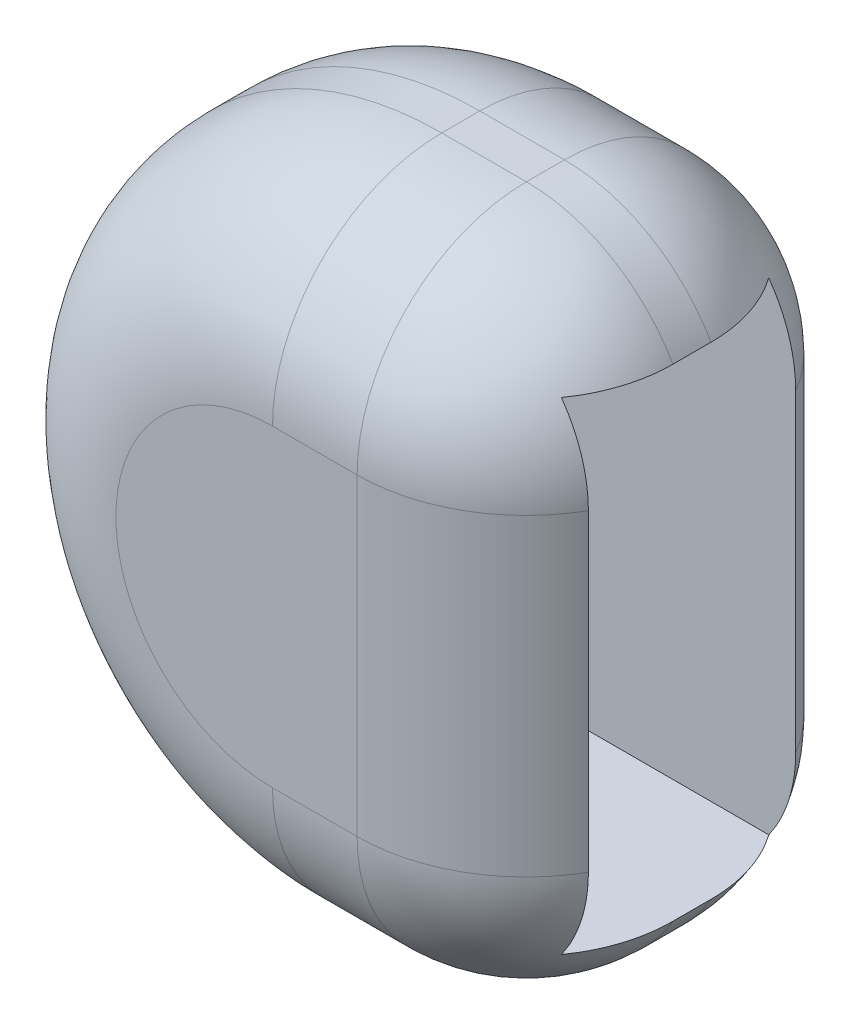
ISO-10303-21;
HEADER;
FILE_DESCRIPTION(('STEP AP214'),'2;1');
FILE_NAME('part.step','',(''),(''),'','','');
FILE_SCHEMA(('AUTOMOTIVE_DESIGN { 1 0 10303 214 1 1 1 1 }'));
ENDSEC;
DATA;
#1=APPLICATION_CONTEXT('core data for automotive mechanical design processes');
#2=APPLICATION_PROTOCOL_DEFINITION('international standard','automotive_design',2000,#1);
#3=PRODUCT_CONTEXT('',#1,'mechanical');
#4=PRODUCT('Part','Part','',(#3));
#5=PRODUCT_RELATED_PRODUCT_CATEGORY('part','',(#4));
#6=PRODUCT_DEFINITION_FORMATION('','',#4);
#7=PRODUCT_DEFINITION_CONTEXT('part definition',#1,'design');
#8=PRODUCT_DEFINITION('design','',#6,#7);
#9=PRODUCT_DEFINITION_SHAPE('','',#8);
#10=(LENGTH_UNIT() NAMED_UNIT(*) SI_UNIT(.MILLI.,.METRE.));
#11=(NAMED_UNIT(*) PLANE_ANGLE_UNIT() SI_UNIT($,.RADIAN.));
#12=(NAMED_UNIT(*) SI_UNIT($,.STERADIAN.) SOLID_ANGLE_UNIT());
#13=UNCERTAINTY_MEASURE_WITH_UNIT(LENGTH_MEASURE(1.E-05),#10,'distance_accuracy_value','');
#14=(GEOMETRIC_REPRESENTATION_CONTEXT(3) GLOBAL_UNCERTAINTY_ASSIGNED_CONTEXT((#13)) GLOBAL_UNIT_ASSIGNED_CONTEXT((#10,
#11,#12)) REPRESENTATION_CONTEXT('',''));
#15=CARTESIAN_POINT('',(0.,0.,0.));
#16=DIRECTION('',(0.,0.,1.));
#17=DIRECTION('',(1.,0.,0.));
#18=AXIS2_PLACEMENT_3D('',#15,#16,#17);
#19=CARTESIAN_POINT('',(0.,0.,12.25));
#20=DIRECTION('',(0.,0.,-1.));
#21=DIRECTION('',(-1.,0.,0.));
#22=AXIS2_PLACEMENT_3D('',#19,#20,#21);
#23=CYLINDRICAL_SURFACE('',#22,14.25);
#24=CARTESIAN_POINT('',(0.,0.,0.));
#25=DIRECTION('',(0.,0.,-1.));
#26=DIRECTION('',(-1.,0.,0.));
#27=AXIS2_PLACEMENT_3D('',#24,#25,#26);
#28=CIRCLE('',#27,14.25);
#29=CARTESIAN_POINT('',(0.,-14.25,0.));
#30=VERTEX_POINT('',#29);
#31=CARTESIAN_POINT('',(0.,14.25,0.));
#32=VERTEX_POINT('',#31);
#33=EDGE_CURVE('E168',#30,#32,#28,.T.);
#34=ORIENTED_EDGE('',*,*,#33,.T.);
#35=DIRECTION('',(0.,0.,-1.));
#36=VECTOR('',#35,1.);
#37=CARTESIAN_POINT('',(0.,14.25,12.25));
#38=LINE('',#37,#36);
#39=CARTESIAN_POINT('',(0.,14.25,12.25));
#40=VERTEX_POINT('',#39);
#41=EDGE_CURVE('E178',#40,#32,#38,.T.);
#42=ORIENTED_EDGE('',*,*,#41,.F.);
#43=CARTESIAN_POINT('',(0.,0.,12.25));
#44=DIRECTION('',(0.,0.,-1.));
#45=DIRECTION('',(-1.,0.,0.));
#46=AXIS2_PLACEMENT_3D('',#43,#44,#45);
#47=CIRCLE('',#46,14.25);
#48=CARTESIAN_POINT('',(0.,-14.25,12.25));
#49=VERTEX_POINT('',#48);
#50=EDGE_CURVE('E204',#49,#40,#47,.T.);
#51=ORIENTED_EDGE('',*,*,#50,.F.);
#52=DIRECTION('',(0.,0.,-1.));
#53=VECTOR('',#52,1.);
#54=CARTESIAN_POINT('',(0.,-14.25,12.25));
#55=LINE('',#54,#53);
#56=EDGE_CURVE('E190',#49,#30,#55,.T.);
#57=ORIENTED_EDGE('',*,*,#56,.T.);
#58=EDGE_LOOP('',(#34,#42,#51,#57));
#59=FACE_BOUND('',#58,.T.);
#60=ADVANCED_FACE('F47',(#59),#23,.F.);
#61=CARTESIAN_POINT('',(15.,14.25,12.25));
#62=DIRECTION('',(0.,1.,0.));
#63=DIRECTION('',(-1.,0.,0.));
#64=AXIS2_PLACEMENT_3D('',#61,#62,#63);
#65=PLANE('',#64);
#66=DIRECTION('',(0.,0.,-1.));
#67=VECTOR('',#66,1.);
#68=CARTESIAN_POINT('',(13.6602540378444,14.25,5.));
#69=LINE('',#68,#67);
#70=CARTESIAN_POINT('',(13.6602540378444,14.25,5.));
#71=VERTEX_POINT('',#70);
#72=CARTESIAN_POINT('',(13.6602540378444,14.25,7.25));
#73=VERTEX_POINT('',#72);
#74=EDGE_CURVE('E291',#71,#73,#69,.F.);
#75=ORIENTED_EDGE('',*,*,#74,.T.);
#76=CARTESIAN_POINT('',(5.,14.25,7.25));
#77=DIRECTION('',(0.,1.,0.));
#78=DIRECTION('',(-1.,0.,0.));
#79=AXIS2_PLACEMENT_3D('',#76,#77,#78);
#80=CIRCLE('',#79,8.66025403784439);
#81=CARTESIAN_POINT('',(12.0710678118655,14.25,12.25));
#82=VERTEX_POINT('',#81);
#83=EDGE_CURVE('E294',#73,#82,#80,.F.);
#84=ORIENTED_EDGE('',*,*,#83,.T.);
#85=DIRECTION('',(1.,0.,0.));
#86=VECTOR('',#85,1.);
#87=CARTESIAN_POINT('',(15.,14.25,12.25));
#88=LINE('',#87,#86);
#89=EDGE_CURVE('E181',#40,#82,#88,.T.);
#90=ORIENTED_EDGE('',*,*,#89,.F.);
#91=ORIENTED_EDGE('',*,*,#41,.T.);
#92=DIRECTION('',(1.,0.,0.));
#93=VECTOR('',#92,1.);
#94=CARTESIAN_POINT('',(15.,14.25,0.));
#95=LINE('',#94,#93);
#96=CARTESIAN_POINT('',(12.0710678118655,14.25,0.));
#97=VERTEX_POINT('',#96);
#98=EDGE_CURVE('E163',#32,#97,#95,.T.);
#99=ORIENTED_EDGE('',*,*,#98,.T.);
#100=CARTESIAN_POINT('',(5.,14.25,5.));
#101=DIRECTION('',(0.,1.,0.));
#102=DIRECTION('',(-1.,0.,0.));
#103=AXIS2_PLACEMENT_3D('',#100,#101,#102);
#104=CIRCLE('',#103,8.66025403784439);
#105=EDGE_CURVE('E288',#97,#71,#104,.F.);
#106=ORIENTED_EDGE('',*,*,#105,.T.);
#107=EDGE_LOOP('',(#75,#84,#90,#91,#99,#106));
#108=FACE_BOUND('',#107,.T.);
#109=ADVANCED_FACE('F179',(#108),#65,.F.);
#110=CARTESIAN_POINT('',(0.,19.25,12.25));
#111=DIRECTION('',(0.,-1.,0.));
#112=DIRECTION('',(1.,0.,0.));
#113=AXIS2_PLACEMENT_3D('',#110,#111,#112);
#114=PLANE('',#113);
#115=DIRECTION('',(-1.,0.,0.));
#116=VECTOR('',#115,1.);
#117=CARTESIAN_POINT('',(15.,19.25,7.25));
#118=LINE('',#117,#116);
#119=CARTESIAN_POINT('',(0.,19.25,7.25));
#120=VERTEX_POINT('',#119);
#121=CARTESIAN_POINT('',(5.,19.25,7.25));
#122=VERTEX_POINT('',#121);
#123=EDGE_CURVE('E226',#120,#122,#118,.F.);
#124=ORIENTED_EDGE('',*,*,#123,.T.);
#125=DIRECTION('',(0.,0.,-1.));
#126=VECTOR('',#125,1.);
#127=CARTESIAN_POINT('',(5.,19.25,12.25));
#128=LINE('',#127,#126);
#129=CARTESIAN_POINT('',(5.,19.25,5.));
#130=VERTEX_POINT('',#129);
#131=EDGE_CURVE('E300',#122,#130,#128,.T.);
#132=ORIENTED_EDGE('',*,*,#131,.T.);
#133=DIRECTION('',(-1.,0.,0.));
#134=VECTOR('',#133,1.);
#135=CARTESIAN_POINT('',(0.,19.25,5.));
#136=LINE('',#135,#134);
#137=CARTESIAN_POINT('',(0.,19.25,5.));
#138=VERTEX_POINT('',#137);
#139=EDGE_CURVE('E223',#130,#138,#136,.T.);
#140=ORIENTED_EDGE('',*,*,#139,.T.);
#141=DIRECTION('',(0.,0.,-1.));
#142=VECTOR('',#141,1.);
#143=CARTESIAN_POINT('',(0.,19.25,12.25));
#144=LINE('',#143,#142);
#145=EDGE_CURVE('E187',#120,#138,#144,.T.);
#146=ORIENTED_EDGE('',*,*,#145,.F.);
#147=EDGE_LOOP('',(#124,#132,#140,#146));
#148=FACE_BOUND('',#147,.T.);
#149=ADVANCED_FACE('F374',(#148),#114,.F.);
#150=CARTESIAN_POINT('',(0.,0.,12.25));
#151=DIRECTION('',(0.,0.,-1.));
#152=DIRECTION('',(-1.,0.,0.));
#153=AXIS2_PLACEMENT_3D('',#150,#151,#152);
#154=CYLINDRICAL_SURFACE('',#153,19.25);
#155=DIRECTION('',(0.,0.,-1.));
#156=VECTOR('',#155,1.);
#157=CARTESIAN_POINT('',(0.,-19.25,12.25));
#158=LINE('',#157,#156);
#159=CARTESIAN_POINT('',(0.,-19.25,7.25));
#160=VERTEX_POINT('',#159);
#161=CARTESIAN_POINT('',(0.,-19.25,5.));
#162=VERTEX_POINT('',#161);
#163=EDGE_CURVE('E207',#160,#162,#158,.T.);
#164=ORIENTED_EDGE('',*,*,#163,.F.);
#165=CARTESIAN_POINT('',(0.,0.,7.25));
#166=DIRECTION('',(0.,0.,1.));
#167=DIRECTION('',(1.,0.,0.));
#168=AXIS2_PLACEMENT_3D('',#165,#166,#167);
#169=CIRCLE('',#168,19.25);
#170=EDGE_CURVE('E248',#160,#120,#169,.F.);
#171=ORIENTED_EDGE('',*,*,#170,.T.);
#172=ORIENTED_EDGE('',*,*,#145,.T.);
#173=CARTESIAN_POINT('',(0.,0.,5.));
#174=DIRECTION('',(0.,0.,1.));
#175=DIRECTION('',(1.,0.,0.));
#176=AXIS2_PLACEMENT_3D('',#173,#174,#175);
#177=CIRCLE('',#176,19.25);
#178=EDGE_CURVE('E245',#138,#162,#177,.T.);
#179=ORIENTED_EDGE('',*,*,#178,.T.);
#180=EDGE_LOOP('',(#164,#171,#172,#179));
#181=FACE_BOUND('',#180,.T.);
#182=ADVANCED_FACE('F370',(#181),#154,.T.);
#183=CARTESIAN_POINT('',(15.,-19.25,12.25));
#184=DIRECTION('',(0.,1.,0.));
#185=DIRECTION('',(-1.,0.,0.));
#186=AXIS2_PLACEMENT_3D('',#183,#184,#185);
#187=PLANE('',#186);
#188=DIRECTION('',(1.,0.,0.));
#189=VECTOR('',#188,1.);
#190=CARTESIAN_POINT('',(15.,-19.25,5.));
#191=LINE('',#190,#189);
#192=CARTESIAN_POINT('',(5.,-19.25,5.));
#193=VERTEX_POINT('',#192);
#194=EDGE_CURVE('E230',#162,#193,#191,.T.);
#195=ORIENTED_EDGE('',*,*,#194,.T.);
#196=DIRECTION('',(0.,0.,-1.));
#197=VECTOR('',#196,1.);
#198=CARTESIAN_POINT('',(5.,-19.25,12.25));
#199=LINE('',#198,#197);
#200=CARTESIAN_POINT('',(5.,-19.25,7.25));
#201=VERTEX_POINT('',#200);
#202=EDGE_CURVE('E11',#193,#201,#199,.F.);
#203=ORIENTED_EDGE('',*,*,#202,.T.);
#204=DIRECTION('',(1.,0.,0.));
#205=VECTOR('',#204,1.);
#206=CARTESIAN_POINT('',(0.,-19.25,7.25));
#207=LINE('',#206,#205);
#208=EDGE_CURVE('E233',#201,#160,#207,.F.);
#209=ORIENTED_EDGE('',*,*,#208,.T.);
#210=ORIENTED_EDGE('',*,*,#163,.T.);
#211=EDGE_LOOP('',(#195,#203,#209,#210));
#212=FACE_BOUND('',#211,.T.);
#213=ADVANCED_FACE('F572',(#212),#187,.F.);
#214=CARTESIAN_POINT('',(0.,-14.25,12.25));
#215=DIRECTION('',(0.,-1.,0.));
#216=DIRECTION('',(1.,0.,0.));
#217=AXIS2_PLACEMENT_3D('',#214,#215,#216);
#218=PLANE('',#217);
#219=DIRECTION('',(-1.,0.,0.));
#220=VECTOR('',#219,1.);
#221=CARTESIAN_POINT('',(0.,-14.25,12.25));
#222=LINE('',#221,#220);
#223=CARTESIAN_POINT('',(12.0710678118655,-14.25,12.25));
#224=VERTEX_POINT('',#223);
#225=EDGE_CURVE('E199',#224,#49,#222,.T.);
#226=ORIENTED_EDGE('',*,*,#225,.F.);
#227=CARTESIAN_POINT('',(5.,-14.25,7.25));
#228=DIRECTION('',(0.,-1.,0.));
#229=DIRECTION('',(1.,0.,0.));
#230=AXIS2_PLACEMENT_3D('',#227,#228,#229);
#231=CIRCLE('',#230,8.66025403784439);
#232=CARTESIAN_POINT('',(13.6602540378444,-14.25,7.25));
#233=VERTEX_POINT('',#232);
#234=EDGE_CURVE('E278',#224,#233,#231,.F.);
#235=ORIENTED_EDGE('',*,*,#234,.T.);
#236=DIRECTION('',(0.,0.,-1.));
#237=VECTOR('',#236,1.);
#238=CARTESIAN_POINT('',(13.6602540378444,-14.25,7.25));
#239=LINE('',#238,#237);
#240=CARTESIAN_POINT('',(13.6602540378444,-14.25,5.));
#241=VERTEX_POINT('',#240);
#242=EDGE_CURVE('E272',#233,#241,#239,.T.);
#243=ORIENTED_EDGE('',*,*,#242,.T.);
#244=CARTESIAN_POINT('',(5.,-14.25,5.));
#245=DIRECTION('',(0.,-1.,0.));
#246=DIRECTION('',(1.,0.,0.));
#247=AXIS2_PLACEMENT_3D('',#244,#245,#246);
#248=CIRCLE('',#247,8.66025403784439);
#249=CARTESIAN_POINT('',(12.0710678118655,-14.25,0.));
#250=VERTEX_POINT('',#249);
#251=EDGE_CURVE('E275',#241,#250,#248,.F.);
#252=ORIENTED_EDGE('',*,*,#251,.T.);
#253=DIRECTION('',(-1.,0.,0.));
#254=VECTOR('',#253,1.);
#255=CARTESIAN_POINT('',(0.,-14.25,0.));
#256=LINE('',#255,#254);
#257=EDGE_CURVE('E175',#250,#30,#256,.T.);
#258=ORIENTED_EDGE('',*,*,#257,.T.);
#259=ORIENTED_EDGE('',*,*,#56,.F.);
#260=EDGE_LOOP('',(#226,#235,#243,#252,#258,#259));
#261=FACE_BOUND('',#260,.T.);
#262=ADVANCED_FACE('F405',(#261),#218,.F.);
#263=CARTESIAN_POINT('',(0.,0.,12.25));
#264=DIRECTION('',(0.,0.,1.));
#265=DIRECTION('',(1.,0.,0.));
#266=AXIS2_PLACEMENT_3D('',#263,#264,#265);
#267=PLANE('',#266);
#268=DIRECTION('',(0.,-1.,0.));
#269=VECTOR('',#268,1.);
#270=CARTESIAN_POINT('',(13.6602540378444,9.25,12.25));
#271=LINE('',#270,#269);
#272=CARTESIAN_POINT('',(13.6602540378444,9.25,12.25));
#273=VERTEX_POINT('',#272);
#274=CARTESIAN_POINT('',(13.6602540378444,-9.25,12.25));
#275=VERTEX_POINT('',#274);
#276=EDGE_CURVE('E265',#273,#275,#271,.T.);
#277=ORIENTED_EDGE('',*,*,#276,.T.);
#278=CARTESIAN_POINT('',(5.,-9.25,12.25));
#279=DIRECTION('',(0.,0.,1.));
#280=DIRECTION('',(1.,0.,0.));
#281=AXIS2_PLACEMENT_3D('',#278,#279,#280);
#282=CIRCLE('',#281,8.66025403784439);
#283=EDGE_CURVE('E268',#275,#224,#282,.F.);
#284=ORIENTED_EDGE('',*,*,#283,.T.);
#285=ORIENTED_EDGE('',*,*,#225,.T.);
#286=ORIENTED_EDGE('',*,*,#50,.T.);
#287=ORIENTED_EDGE('',*,*,#89,.T.);
#288=CARTESIAN_POINT('',(5.,9.25,12.25));
#289=DIRECTION('',(0.,0.,1.));
#290=DIRECTION('',(1.,0.,0.));
#291=AXIS2_PLACEMENT_3D('',#288,#289,#290);
#292=CIRCLE('',#291,8.66025403784439);
#293=EDGE_CURVE('E251',#82,#273,#292,.F.);
#294=ORIENTED_EDGE('',*,*,#293,.T.);
#295=EDGE_LOOP('',(#277,#284,#285,#286,#287,#294));
#296=FACE_BOUND('',#295,.T.);
#297=ADVANCED_FACE('F554',(#296),#267,.F.);
#298=CARTESIAN_POINT('',(0.,0.,17.25));
#299=DIRECTION('',(0.,0.,1.));
#300=DIRECTION('',(1.,0.,0.));
#301=AXIS2_PLACEMENT_3D('',#298,#299,#300);
#302=PLANE('',#301);
#303=DIRECTION('',(1.,0.,0.));
#304=VECTOR('',#303,1.);
#305=CARTESIAN_POINT('',(15.,-9.25000000000001,17.25));
#306=LINE('',#305,#304);
#307=CARTESIAN_POINT('',(0.,-9.25,17.25));
#308=VERTEX_POINT('',#307);
#309=CARTESIAN_POINT('',(5.,-9.25,17.25));
#310=VERTEX_POINT('',#309);
#311=EDGE_CURVE('E216',#308,#310,#306,.T.);
#312=ORIENTED_EDGE('',*,*,#311,.T.);
#313=DIRECTION('',(0.,1.,0.));
#314=VECTOR('',#313,1.);
#315=CARTESIAN_POINT('',(5.,9.25,17.25));
#316=LINE('',#315,#314);
#317=CARTESIAN_POINT('',(5.,9.25,17.25));
#318=VERTEX_POINT('',#317);
#319=EDGE_CURVE('E285',#310,#318,#316,.T.);
#320=ORIENTED_EDGE('',*,*,#319,.T.);
#321=DIRECTION('',(-1.,0.,0.));
#322=VECTOR('',#321,1.);
#323=CARTESIAN_POINT('',(0.,9.25,17.25));
#324=LINE('',#323,#322);
#325=CARTESIAN_POINT('',(0.,9.25,17.25));
#326=VERTEX_POINT('',#325);
#327=EDGE_CURVE('E220',#318,#326,#324,.T.);
#328=ORIENTED_EDGE('',*,*,#327,.T.);
#329=CARTESIAN_POINT('',(0.,0.,17.25));
#330=DIRECTION('',(0.,0.,1.));
#331=DIRECTION('',(1.,0.,0.));
#332=AXIS2_PLACEMENT_3D('',#329,#330,#331);
#333=CIRCLE('',#332,9.25);
#334=EDGE_CURVE('E186',#326,#308,#333,.T.);
#335=ORIENTED_EDGE('',*,*,#334,.T.);
#336=EDGE_LOOP('',(#312,#320,#328,#335));
#337=FACE_BOUND('',#336,.T.);
#338=ADVANCED_FACE('F386',(#337),#302,.T.);
#339=CARTESIAN_POINT('',(0.,0.,0.));
#340=DIRECTION('',(0.,0.,1.));
#341=DIRECTION('',(1.,0.,0.));
#342=AXIS2_PLACEMENT_3D('',#339,#340,#341);
#343=PLANE('',#342);
#344=DIRECTION('',(0.,1.,0.));
#345=VECTOR('',#344,1.);
#346=CARTESIAN_POINT('',(13.6602540378444,0.,0.));
#347=LINE('',#346,#345);
#348=CARTESIAN_POINT('',(13.6602540378444,-9.25,0.));
#349=VERTEX_POINT('',#348);
#350=CARTESIAN_POINT('',(13.6602540378444,9.25,0.));
#351=VERTEX_POINT('',#350);
#352=EDGE_CURVE('E306',#349,#351,#347,.T.);
#353=ORIENTED_EDGE('',*,*,#352,.T.);
#354=CARTESIAN_POINT('',(5.,9.25,0.));
#355=DIRECTION('',(0.,0.,1.));
#356=DIRECTION('',(1.,0.,0.));
#357=AXIS2_PLACEMENT_3D('',#354,#355,#356);
#358=CIRCLE('',#357,8.66025403784439);
#359=EDGE_CURVE('E171',#351,#97,#358,.T.);
#360=ORIENTED_EDGE('',*,*,#359,.T.);
#361=ORIENTED_EDGE('',*,*,#98,.F.);
#362=ORIENTED_EDGE('',*,*,#33,.F.);
#363=ORIENTED_EDGE('',*,*,#257,.F.);
#364=CARTESIAN_POINT('',(5.,-9.25,0.));
#365=DIRECTION('',(0.,0.,1.));
#366=DIRECTION('',(1.,0.,0.));
#367=AXIS2_PLACEMENT_3D('',#364,#365,#366);
#368=CIRCLE('',#367,8.66025403784439);
#369=EDGE_CURVE('E303',#250,#349,#368,.T.);
#370=ORIENTED_EDGE('',*,*,#369,.T.);
#371=EDGE_LOOP('',(#353,#360,#361,#362,#363,#370));
#372=FACE_BOUND('',#371,.T.);
#373=ADVANCED_FACE('F165',(#372),#343,.T.);
#374=CARTESIAN_POINT('',(0.,0.,-5.));
#375=DIRECTION('',(0.,0.,1.));
#376=DIRECTION('',(1.,0.,0.));
#377=AXIS2_PLACEMENT_3D('',#374,#375,#376);
#378=PLANE('',#377);
#379=DIRECTION('',(-1.,0.,0.));
#380=VECTOR('',#379,1.);
#381=CARTESIAN_POINT('',(0.,9.25,-5.));
#382=LINE('',#381,#380);
#383=CARTESIAN_POINT('',(0.,9.25,-5.));
#384=VERTEX_POINT('',#383);
#385=CARTESIAN_POINT('',(5.,9.25,-5.));
#386=VERTEX_POINT('',#385);
#387=EDGE_CURVE('E242',#384,#386,#382,.F.);
#388=ORIENTED_EDGE('',*,*,#387,.T.);
#389=DIRECTION('',(0.,1.,0.));
#390=VECTOR('',#389,1.);
#391=CARTESIAN_POINT('',(5.,0.,-5.));
#392=LINE('',#391,#390);
#393=CARTESIAN_POINT('',(5.,-9.25,-5.));
#394=VERTEX_POINT('',#393);
#395=EDGE_CURVE('E72',#386,#394,#392,.F.);
#396=ORIENTED_EDGE('',*,*,#395,.T.);
#397=DIRECTION('',(1.,0.,0.));
#398=VECTOR('',#397,1.);
#399=CARTESIAN_POINT('',(0.,-9.25,-5.));
#400=LINE('',#399,#398);
#401=CARTESIAN_POINT('',(0.,-9.25,-5.));
#402=VERTEX_POINT('',#401);
#403=EDGE_CURVE('E239',#394,#402,#400,.F.);
#404=ORIENTED_EDGE('',*,*,#403,.T.);
#405=CARTESIAN_POINT('',(0.,0.,-5.));
#406=DIRECTION('',(0.,0.,1.));
#407=DIRECTION('',(1.,0.,0.));
#408=AXIS2_PLACEMENT_3D('',#405,#406,#407);
#409=CIRCLE('',#408,9.25);
#410=EDGE_CURVE('E236',#402,#384,#409,.F.);
#411=ORIENTED_EDGE('',*,*,#410,.T.);
#412=EDGE_LOOP('',(#388,#396,#404,#411));
#413=FACE_BOUND('',#412,.T.);
#414=ADVANCED_FACE('F361',(#413),#378,.F.);
#415=CARTESIAN_POINT('',(0.,-9.25,7.25));
#416=DIRECTION('',(-1.,0.,0.));
#417=DIRECTION('',(0.,-1.,0.));
#418=AXIS2_PLACEMENT_3D('',#415,#416,#417);
#419=CYLINDRICAL_SURFACE('',#418,10.);
#420=ORIENTED_EDGE('',*,*,#208,.F.);
#421=CARTESIAN_POINT('',(5.,-9.25,7.25));
#422=DIRECTION('',(-1.,0.,0.));
#423=DIRECTION('',(0.,-1.,0.));
#424=AXIS2_PLACEMENT_3D('',#421,#422,#423);
#425=CIRCLE('',#424,10.);
#426=EDGE_CURVE('E281',#201,#310,#425,.T.);
#427=ORIENTED_EDGE('',*,*,#426,.T.);
#428=ORIENTED_EDGE('',*,*,#311,.F.);
#429=CARTESIAN_POINT('',(0.,-9.25,7.25));
#430=DIRECTION('',(-1.,0.,0.));
#431=DIRECTION('',(0.,-1.,0.));
#432=AXIS2_PLACEMENT_3D('',#429,#430,#431);
#433=CIRCLE('',#432,10.);
#434=EDGE_CURVE('E192',#160,#308,#433,.T.);
#435=ORIENTED_EDGE('',*,*,#434,.F.);
#436=EDGE_LOOP('',(#420,#427,#428,#435));
#437=FACE_BOUND('',#436,.T.);
#438=ADVANCED_FACE('F389',(#437),#419,.T.);
#439=CARTESIAN_POINT('',(0.,0.,7.25));
#440=DIRECTION('',(0.,0.,1.));
#441=DIRECTION('',(1.,0.,0.));
#442=AXIS2_PLACEMENT_3D('',#439,#440,#441);
#443=DEGENERATE_TOROIDAL_SURFACE('',#442,9.25,10.,.T.);
#444=ORIENTED_EDGE('',*,*,#434,.T.);
#445=ORIENTED_EDGE('',*,*,#334,.F.);
#446=CARTESIAN_POINT('',(0.,9.25,7.25));
#447=DIRECTION('',(1.,0.,0.));
#448=DIRECTION('',(0.,0.,-1.));
#449=AXIS2_PLACEMENT_3D('',#446,#447,#448);
#450=CIRCLE('',#449,10.);
#451=EDGE_CURVE('E196',#120,#326,#450,.T.);
#452=ORIENTED_EDGE('',*,*,#451,.F.);
#453=ORIENTED_EDGE('',*,*,#170,.F.);
#454=EDGE_LOOP('',(#444,#445,#452,#453));
#455=FACE_BOUND('',#454,.T.);
#456=ADVANCED_FACE('F382',(#455),#443,.T.);
#457=CARTESIAN_POINT('',(0.,9.25,7.25));
#458=DIRECTION('',(1.,0.,0.));
#459=DIRECTION('',(0.,1.,0.));
#460=AXIS2_PLACEMENT_3D('',#457,#458,#459);
#461=CYLINDRICAL_SURFACE('',#460,10.);
#462=ORIENTED_EDGE('',*,*,#327,.F.);
#463=CARTESIAN_POINT('',(5.,9.25,7.25));
#464=DIRECTION('',(1.,0.,0.));
#465=DIRECTION('',(0.,1.,0.));
#466=AXIS2_PLACEMENT_3D('',#463,#464,#465);
#467=CIRCLE('',#466,10.);
#468=EDGE_CURVE('E297',#318,#122,#467,.F.);
#469=ORIENTED_EDGE('',*,*,#468,.T.);
#470=ORIENTED_EDGE('',*,*,#123,.F.);
#471=ORIENTED_EDGE('',*,*,#451,.T.);
#472=EDGE_LOOP('',(#462,#469,#470,#471));
#473=FACE_BOUND('',#472,.T.);
#474=ADVANCED_FACE('F378',(#473),#461,.T.);
#475=CARTESIAN_POINT('',(15.,-9.25000000000001,5.));
#476=DIRECTION('',(1.,0.,0.));
#477=DIRECTION('',(0.,1.,0.));
#478=AXIS2_PLACEMENT_3D('',#475,#476,#477);
#479=CYLINDRICAL_SURFACE('',#478,10.);
#480=ORIENTED_EDGE('',*,*,#403,.F.);
#481=CARTESIAN_POINT('',(5.,-9.25,5.));
#482=DIRECTION('',(1.,0.,0.));
#483=DIRECTION('',(0.,1.,0.));
#484=AXIS2_PLACEMENT_3D('',#481,#482,#483);
#485=CIRCLE('',#484,10.);
#486=EDGE_CURVE('E57',#394,#193,#485,.F.);
#487=ORIENTED_EDGE('',*,*,#486,.T.);
#488=ORIENTED_EDGE('',*,*,#194,.F.);
#489=CARTESIAN_POINT('',(0.,-9.25,5.));
#490=DIRECTION('',(-1.,0.,0.));
#491=DIRECTION('',(0.,-1.,0.));
#492=AXIS2_PLACEMENT_3D('',#489,#490,#491);
#493=CIRCLE('',#492,10.);
#494=EDGE_CURVE('E254',#402,#162,#493,.T.);
#495=ORIENTED_EDGE('',*,*,#494,.F.);
#496=EDGE_LOOP('',(#480,#487,#488,#495));
#497=FACE_BOUND('',#496,.T.);
#498=ADVANCED_FACE('F431',(#497),#479,.T.);
#499=CARTESIAN_POINT('',(0.,0.,5.));
#500=DIRECTION('',(0.,0.,1.));
#501=DIRECTION('',(1.,0.,0.));
#502=AXIS2_PLACEMENT_3D('',#499,#500,#501);
#503=DEGENERATE_TOROIDAL_SURFACE('',#502,9.25,10.,.T.);
#504=ORIENTED_EDGE('',*,*,#494,.T.);
#505=ORIENTED_EDGE('',*,*,#178,.F.);
#506=CARTESIAN_POINT('',(0.,9.25,5.));
#507=DIRECTION('',(1.,0.,0.));
#508=DIRECTION('',(0.,1.,0.));
#509=AXIS2_PLACEMENT_3D('',#506,#507,#508);
#510=CIRCLE('',#509,10.);
#511=EDGE_CURVE('E256',#384,#138,#510,.T.);
#512=ORIENTED_EDGE('',*,*,#511,.F.);
#513=ORIENTED_EDGE('',*,*,#410,.F.);
#514=EDGE_LOOP('',(#504,#505,#512,#513));
#515=FACE_BOUND('',#514,.T.);
#516=ADVANCED_FACE('F365',(#515),#503,.T.);
#517=CARTESIAN_POINT('',(0.,9.25,5.));
#518=DIRECTION('',(-1.,0.,0.));
#519=DIRECTION('',(0.,-1.,0.));
#520=AXIS2_PLACEMENT_3D('',#517,#518,#519);
#521=CYLINDRICAL_SURFACE('',#520,10.);
#522=ORIENTED_EDGE('',*,*,#139,.F.);
#523=CARTESIAN_POINT('',(5.,9.25,5.));
#524=DIRECTION('',(-1.,0.,0.));
#525=DIRECTION('',(0.,-1.,0.));
#526=AXIS2_PLACEMENT_3D('',#523,#524,#525);
#527=CIRCLE('',#526,10.);
#528=EDGE_CURVE('E311',#130,#386,#527,.T.);
#529=ORIENTED_EDGE('',*,*,#528,.T.);
#530=ORIENTED_EDGE('',*,*,#387,.F.);
#531=ORIENTED_EDGE('',*,*,#511,.T.);
#532=EDGE_LOOP('',(#522,#529,#530,#531));
#533=FACE_BOUND('',#532,.T.);
#534=ADVANCED_FACE('F359',(#533),#521,.T.);
#535=CARTESIAN_POINT('',(5.,9.25,5.));
#536=DIRECTION('',(-1.,0.,0.));
#537=DIRECTION('',(0.,0.,1.));
#538=AXIS2_PLACEMENT_3D('',#535,#536,#537);
#539=SPHERICAL_SURFACE('',#538,10.);
#540=CARTESIAN_POINT('',(5.,9.25,5.));
#541=DIRECTION('',(0.,-1.,0.));
#542=DIRECTION('',(0.,0.,-1.));
#543=AXIS2_PLACEMENT_3D('',#540,#541,#542);
#544=CIRCLE('',#543,10.);
#545=EDGE_CURVE('E340',#386,#351,#544,.T.);
#546=ORIENTED_EDGE('',*,*,#545,.F.);
#547=ORIENTED_EDGE('',*,*,#528,.F.);
#548=CARTESIAN_POINT('',(5.,9.25,5.));
#549=DIRECTION('',(0.,0.,1.));
#550=DIRECTION('',(1.,0.,0.));
#551=AXIS2_PLACEMENT_3D('',#548,#549,#550);
#552=CIRCLE('',#551,10.);
#553=EDGE_CURVE('E51',#71,#130,#552,.T.);
#554=ORIENTED_EDGE('',*,*,#553,.F.);
#555=ORIENTED_EDGE('',*,*,#105,.F.);
#556=ORIENTED_EDGE('',*,*,#359,.F.);
#557=EDGE_LOOP('',(#546,#547,#554,#555,#556));
#558=FACE_BOUND('',#557,.T.);
#559=ADVANCED_FACE('F49',(#558),#539,.T.);
#560=CARTESIAN_POINT('',(5.,9.25,12.25));
#561=DIRECTION('',(0.,0.,-1.));
#562=DIRECTION('',(-1.,0.,0.));
#563=AXIS2_PLACEMENT_3D('',#560,#561,#562);
#564=CYLINDRICAL_SURFACE('',#563,10.);
#565=ORIENTED_EDGE('',*,*,#553,.T.);
#566=ORIENTED_EDGE('',*,*,#131,.F.);
#567=CARTESIAN_POINT('',(5.,9.25,7.25));
#568=DIRECTION('',(0.,0.,1.));
#569=DIRECTION('',(1.,0.,0.));
#570=AXIS2_PLACEMENT_3D('',#567,#568,#569);
#571=CIRCLE('',#570,10.);
#572=EDGE_CURVE('E337',#73,#122,#571,.T.);
#573=ORIENTED_EDGE('',*,*,#572,.F.);
#574=ORIENTED_EDGE('',*,*,#74,.F.);
#575=EDGE_LOOP('',(#565,#566,#573,#574));
#576=FACE_BOUND('',#575,.T.);
#577=ADVANCED_FACE('F352',(#576),#564,.T.);
#578=CARTESIAN_POINT('',(5.,-14.25,5.));
#579=DIRECTION('',(0.,1.,0.));
#580=DIRECTION('',(0.,0.,1.));
#581=AXIS2_PLACEMENT_3D('',#578,#579,#580);
#582=CYLINDRICAL_SURFACE('',#581,10.);
#583=ORIENTED_EDGE('',*,*,#545,.T.);
#584=ORIENTED_EDGE('',*,*,#352,.F.);
#585=CARTESIAN_POINT('',(5.,-9.25,5.));
#586=DIRECTION('',(0.,-1.,0.));
#587=DIRECTION('',(0.,0.,-1.));
#588=AXIS2_PLACEMENT_3D('',#585,#586,#587);
#589=CIRCLE('',#588,10.);
#590=EDGE_CURVE('E333',#394,#349,#589,.T.);
#591=ORIENTED_EDGE('',*,*,#590,.F.);
#592=ORIENTED_EDGE('',*,*,#395,.F.);
#593=EDGE_LOOP('',(#583,#584,#591,#592));
#594=FACE_BOUND('',#593,.T.);
#595=ADVANCED_FACE('F410',(#594),#582,.T.);
#596=CARTESIAN_POINT('',(5.,9.25,7.25));
#597=DIRECTION('',(-1.,0.,0.));
#598=DIRECTION('',(0.,0.,1.));
#599=AXIS2_PLACEMENT_3D('',#596,#597,#598);
#600=SPHERICAL_SURFACE('',#599,10.);
#601=ORIENTED_EDGE('',*,*,#572,.T.);
#602=ORIENTED_EDGE('',*,*,#468,.F.);
#603=CARTESIAN_POINT('',(5.,9.25,7.25));
#604=DIRECTION('',(0.,-1.,0.));
#605=DIRECTION('',(0.,0.,-1.));
#606=AXIS2_PLACEMENT_3D('',#603,#604,#605);
#607=CIRCLE('',#606,10.);
#608=EDGE_CURVE('E329',#273,#318,#607,.T.);
#609=ORIENTED_EDGE('',*,*,#608,.F.);
#610=ORIENTED_EDGE('',*,*,#293,.F.);
#611=ORIENTED_EDGE('',*,*,#83,.F.);
#612=EDGE_LOOP('',(#601,#602,#609,#610,#611));
#613=FACE_BOUND('',#612,.T.);
#614=ADVANCED_FACE('F412',(#613),#600,.T.);
#615=CARTESIAN_POINT('',(5.,-9.25,5.));
#616=DIRECTION('',(-1.,0.,0.));
#617=DIRECTION('',(0.,0.,1.));
#618=AXIS2_PLACEMENT_3D('',#615,#616,#617);
#619=SPHERICAL_SURFACE('',#618,10.);
#620=ORIENTED_EDGE('',*,*,#369,.F.);
#621=ORIENTED_EDGE('',*,*,#251,.F.);
#622=CARTESIAN_POINT('',(5.,-9.25,5.));
#623=DIRECTION('',(0.,0.,1.));
#624=DIRECTION('',(1.,0.,0.));
#625=AXIS2_PLACEMENT_3D('',#622,#623,#624);
#626=CIRCLE('',#625,10.);
#627=EDGE_CURVE('E325',#193,#241,#626,.T.);
#628=ORIENTED_EDGE('',*,*,#627,.F.);
#629=ORIENTED_EDGE('',*,*,#486,.F.);
#630=ORIENTED_EDGE('',*,*,#590,.T.);
#631=EDGE_LOOP('',(#620,#621,#628,#629,#630));
#632=FACE_BOUND('',#631,.T.);
#633=ADVANCED_FACE('F408',(#632),#619,.T.);
#634=CARTESIAN_POINT('',(5.,0.,7.25));
#635=DIRECTION('',(0.,-1.,0.));
#636=DIRECTION('',(0.,0.,-1.));
#637=AXIS2_PLACEMENT_3D('',#634,#635,#636);
#638=CYLINDRICAL_SURFACE('',#637,10.);
#639=ORIENTED_EDGE('',*,*,#608,.T.);
#640=ORIENTED_EDGE('',*,*,#319,.F.);
#641=CARTESIAN_POINT('',(5.,-9.25,7.25));
#642=DIRECTION('',(0.,-1.,0.));
#643=DIRECTION('',(0.,0.,-1.));
#644=AXIS2_PLACEMENT_3D('',#641,#642,#643);
#645=CIRCLE('',#644,10.);
#646=EDGE_CURVE('E322',#275,#310,#645,.T.);
#647=ORIENTED_EDGE('',*,*,#646,.F.);
#648=ORIENTED_EDGE('',*,*,#276,.F.);
#649=EDGE_LOOP('',(#639,#640,#647,#648));
#650=FACE_BOUND('',#649,.T.);
#651=ADVANCED_FACE('F446',(#650),#638,.T.);
#652=CARTESIAN_POINT('',(5.,-9.25,12.25));
#653=DIRECTION('',(0.,0.,-1.));
#654=DIRECTION('',(-1.,0.,0.));
#655=AXIS2_PLACEMENT_3D('',#652,#653,#654);
#656=CYLINDRICAL_SURFACE('',#655,10.);
#657=ORIENTED_EDGE('',*,*,#627,.T.);
#658=ORIENTED_EDGE('',*,*,#242,.F.);
#659=CARTESIAN_POINT('',(5.,-9.25,7.25));
#660=DIRECTION('',(0.,0.,1.));
#661=DIRECTION('',(1.,0.,0.));
#662=AXIS2_PLACEMENT_3D('',#659,#660,#661);
#663=CIRCLE('',#662,10.);
#664=EDGE_CURVE('E318',#201,#233,#663,.T.);
#665=ORIENTED_EDGE('',*,*,#664,.F.);
#666=ORIENTED_EDGE('',*,*,#202,.F.);
#667=EDGE_LOOP('',(#657,#658,#665,#666));
#668=FACE_BOUND('',#667,.T.);
#669=ADVANCED_FACE('F400',(#668),#656,.T.);
#670=CARTESIAN_POINT('',(5.,-9.25,7.25));
#671=DIRECTION('',(-1.,0.,0.));
#672=DIRECTION('',(0.,0.,1.));
#673=AXIS2_PLACEMENT_3D('',#670,#671,#672);
#674=SPHERICAL_SURFACE('',#673,10.);
#675=ORIENTED_EDGE('',*,*,#646,.T.);
#676=ORIENTED_EDGE('',*,*,#426,.F.);
#677=ORIENTED_EDGE('',*,*,#664,.T.);
#678=ORIENTED_EDGE('',*,*,#234,.F.);
#679=ORIENTED_EDGE('',*,*,#283,.F.);
#680=EDGE_LOOP('',(#675,#676,#677,#678,#679));
#681=FACE_BOUND('',#680,.T.);
#682=ADVANCED_FACE('F393',(#681),#674,.T.);
#683=CLOSED_SHELL('',(#60,#109,#149,#182,#213,#262,#297,#338,#373,#414,#438,#456,#474,#498,#516,
#534,#559,#577,#595,#614,#633,#651,#669,#682));
#684=MANIFOLD_SOLID_BREP('B2',#683);
#685=ADVANCED_BREP_SHAPE_REPRESENTATION('',(#18,#684),#14);
#686=SHAPE_DEFINITION_REPRESENTATION(#9,#685);
ENDSEC;
END-ISO-10303-21;
